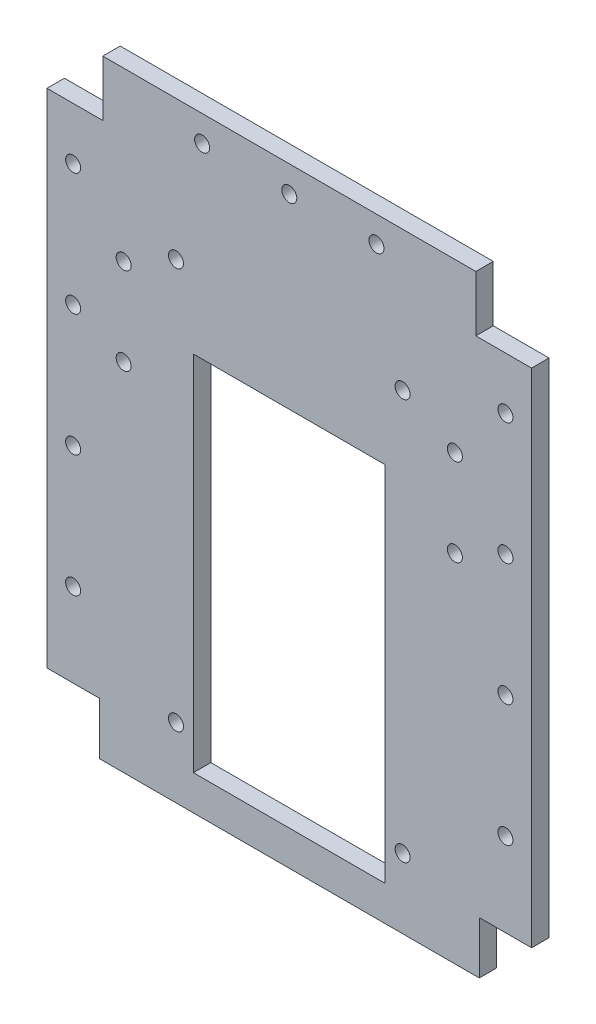
ISO-10303-21;
HEADER;
FILE_DESCRIPTION(('STEP AP214'),'2;1');
FILE_NAME('part.step','',(''),(''),'','','');
FILE_SCHEMA(('AUTOMOTIVE_DESIGN { 1 0 10303 214 1 1 1 1 }'));
ENDSEC;
DATA;
#1=APPLICATION_CONTEXT('core data for automotive mechanical design processes');
#2=APPLICATION_PROTOCOL_DEFINITION('international standard','automotive_design',2000,#1);
#3=PRODUCT_CONTEXT('',#1,'mechanical');
#4=PRODUCT('Part','Part','',(#3));
#5=PRODUCT_RELATED_PRODUCT_CATEGORY('part','',(#4));
#6=PRODUCT_DEFINITION_FORMATION('','',#4);
#7=PRODUCT_DEFINITION_CONTEXT('part definition',#1,'design');
#8=PRODUCT_DEFINITION('design','',#6,#7);
#9=PRODUCT_DEFINITION_SHAPE('','',#8);
#10=(LENGTH_UNIT() NAMED_UNIT(*) SI_UNIT(.MILLI.,.METRE.));
#11=(NAMED_UNIT(*) PLANE_ANGLE_UNIT() SI_UNIT($,.RADIAN.));
#12=(NAMED_UNIT(*) SI_UNIT($,.STERADIAN.) SOLID_ANGLE_UNIT());
#13=UNCERTAINTY_MEASURE_WITH_UNIT(LENGTH_MEASURE(1.E-05),#10,'distance_accuracy_value','');
#14=(GEOMETRIC_REPRESENTATION_CONTEXT(3) GLOBAL_UNCERTAINTY_ASSIGNED_CONTEXT((#13)) GLOBAL_UNIT_ASSIGNED_CONTEXT((#10,
#11,#12)) REPRESENTATION_CONTEXT('',''));
#15=CARTESIAN_POINT('',(0.,0.,0.));
#16=DIRECTION('',(0.,0.,1.));
#17=DIRECTION('',(1.,0.,0.));
#18=AXIS2_PLACEMENT_3D('',#15,#16,#17);
#19=CARTESIAN_POINT('',(0.,0.,5.));
#20=DIRECTION('',(0.,1.,0.));
#21=DIRECTION('',(0.,0.,1.));
#22=AXIS2_PLACEMENT_3D('',#19,#20,#21);
#23=PLANE('',#22);
#24=DIRECTION('',(0.,0.,-1.));
#25=VECTOR('',#24,1.);
#26=CARTESIAN_POINT('',(15.,0.,5.));
#27=LINE('',#26,#25);
#28=CARTESIAN_POINT('',(15.,0.,5.));
#29=VERTEX_POINT('',#28);
#30=CARTESIAN_POINT('',(15.,0.,0.));
#31=VERTEX_POINT('',#30);
#32=EDGE_CURVE('E242',#29,#31,#27,.T.);
#33=ORIENTED_EDGE('',*,*,#32,.F.);
#34=DIRECTION('',(1.,0.,0.));
#35=VECTOR('',#34,1.);
#36=CARTESIAN_POINT('',(0.,0.,5.));
#37=LINE('',#36,#35);
#38=CARTESIAN_POINT('',(0.,0.,5.));
#39=VERTEX_POINT('',#38);
#40=EDGE_CURVE('E393',#39,#29,#37,.T.);
#41=ORIENTED_EDGE('',*,*,#40,.F.);
#42=DIRECTION('',(0.,0.,-1.));
#43=VECTOR('',#42,1.);
#44=CARTESIAN_POINT('',(0.,0.,5.));
#45=LINE('',#44,#43);
#46=CARTESIAN_POINT('',(0.,0.,0.));
#47=VERTEX_POINT('',#46);
#48=EDGE_CURVE('E423',#39,#47,#45,.T.);
#49=ORIENTED_EDGE('',*,*,#48,.T.);
#50=DIRECTION('',(1.,0.,0.));
#51=VECTOR('',#50,1.);
#52=CARTESIAN_POINT('',(0.,0.,0.));
#53=LINE('',#52,#51);
#54=EDGE_CURVE('E409',#47,#31,#53,.T.);
#55=ORIENTED_EDGE('',*,*,#54,.T.);
#56=EDGE_LOOP('',(#33,#41,#49,#55));
#57=FACE_BOUND('',#56,.T.);
#58=ADVANCED_FACE('F47',(#57),#23,.F.);
#59=CARTESIAN_POINT('',(7.50000000000002,24.,0.));
#60=DIRECTION('',(0.,0.,1.));
#61=DIRECTION('',(1.,0.,0.));
#62=AXIS2_PLACEMENT_3D('',#59,#60,#61);
#63=CYLINDRICAL_SURFACE('',#62,2.15);
#64=CARTESIAN_POINT('',(7.50000000000002,24.,0.));
#65=DIRECTION('',(0.,0.,1.));
#66=DIRECTION('',(-1.,0.,0.));
#67=AXIS2_PLACEMENT_3D('',#64,#65,#66);
#68=CIRCLE('',#67,2.15);
#69=CARTESIAN_POINT('',(5.35000000000002,24.,0.));
#70=VERTEX_POINT('',#69);
#71=EDGE_CURVE('E56',#70,#70,#68,.T.);
#72=ORIENTED_EDGE('',*,*,#71,.F.);
#73=EDGE_LOOP('',(#72));
#74=FACE_BOUND('',#73,.T.);
#75=CARTESIAN_POINT('',(7.50000000000002,24.,5.));
#76=DIRECTION('',(0.,0.,1.));
#77=DIRECTION('',(-1.,0.,0.));
#78=AXIS2_PLACEMENT_3D('',#75,#76,#77);
#79=CIRCLE('',#78,2.15);
#80=CARTESIAN_POINT('',(5.35000000000002,24.,5.));
#81=VERTEX_POINT('',#80);
#82=EDGE_CURVE('E11',#81,#81,#79,.T.);
#83=ORIENTED_EDGE('',*,*,#82,.T.);
#84=EDGE_LOOP('',(#83));
#85=FACE_BOUND('',#84,.T.);
#86=ADVANCED_FACE('F49',(#74,#85),#63,.F.);
#87=CARTESIAN_POINT('',(7.50000000000002,59.,0.));
#88=DIRECTION('',(0.,0.,1.));
#89=DIRECTION('',(1.,0.,0.));
#90=AXIS2_PLACEMENT_3D('',#87,#88,#89);
#91=CYLINDRICAL_SURFACE('',#90,2.15);
#92=CARTESIAN_POINT('',(7.50000000000002,59.,0.));
#93=DIRECTION('',(0.,0.,1.));
#94=DIRECTION('',(-1.,0.,0.));
#95=AXIS2_PLACEMENT_3D('',#92,#93,#94);
#96=CIRCLE('',#95,2.15);
#97=CARTESIAN_POINT('',(5.35000000000002,59.,0.));
#98=VERTEX_POINT('',#97);
#99=EDGE_CURVE('E443',#98,#98,#96,.T.);
#100=ORIENTED_EDGE('',*,*,#99,.F.);
#101=EDGE_LOOP('',(#100));
#102=FACE_BOUND('',#101,.T.);
#103=CARTESIAN_POINT('',(7.50000000000002,59.,5.));
#104=DIRECTION('',(0.,0.,1.));
#105=DIRECTION('',(-1.,0.,0.));
#106=AXIS2_PLACEMENT_3D('',#103,#104,#105);
#107=CIRCLE('',#106,2.15);
#108=CARTESIAN_POINT('',(5.35000000000002,59.,5.));
#109=VERTEX_POINT('',#108);
#110=EDGE_CURVE('E447',#109,#109,#107,.T.);
#111=ORIENTED_EDGE('',*,*,#110,.T.);
#112=EDGE_LOOP('',(#111));
#113=FACE_BOUND('',#112,.T.);
#114=ADVANCED_FACE('F457',(#102,#113),#91,.F.);
#115=CARTESIAN_POINT('',(131.5,24.,0.));
#116=DIRECTION('',(0.,0.,1.));
#117=DIRECTION('',(1.,0.,0.));
#118=AXIS2_PLACEMENT_3D('',#115,#116,#117);
#119=CYLINDRICAL_SURFACE('',#118,2.15000000000002);
#120=CARTESIAN_POINT('',(131.5,24.,0.));
#121=DIRECTION('',(0.,0.,1.));
#122=DIRECTION('',(1.,0.,0.));
#123=AXIS2_PLACEMENT_3D('',#120,#121,#122);
#124=CIRCLE('',#123,2.15000000000002);
#125=CARTESIAN_POINT('',(133.65,24.,0.));
#126=VERTEX_POINT('',#125);
#127=EDGE_CURVE('E435',#126,#126,#124,.T.);
#128=ORIENTED_EDGE('',*,*,#127,.F.);
#129=EDGE_LOOP('',(#128));
#130=FACE_BOUND('',#129,.T.);
#131=CARTESIAN_POINT('',(131.5,24.,5.));
#132=DIRECTION('',(0.,0.,1.));
#133=DIRECTION('',(1.,0.,0.));
#134=AXIS2_PLACEMENT_3D('',#131,#132,#133);
#135=CIRCLE('',#134,2.15000000000002);
#136=CARTESIAN_POINT('',(133.65,24.,5.));
#137=VERTEX_POINT('',#136);
#138=EDGE_CURVE('E439',#137,#137,#135,.T.);
#139=ORIENTED_EDGE('',*,*,#138,.T.);
#140=EDGE_LOOP('',(#139));
#141=FACE_BOUND('',#140,.T.);
#142=ADVANCED_FACE('F529',(#130,#141),#119,.F.);
#143=CARTESIAN_POINT('',(131.5,59.,0.));
#144=DIRECTION('',(0.,0.,1.));
#145=DIRECTION('',(1.,0.,0.));
#146=AXIS2_PLACEMENT_3D('',#143,#144,#145);
#147=CYLINDRICAL_SURFACE('',#146,2.15000000000002);
#148=CARTESIAN_POINT('',(131.5,59.,0.));
#149=DIRECTION('',(0.,0.,1.));
#150=DIRECTION('',(1.,0.,0.));
#151=AXIS2_PLACEMENT_3D('',#148,#149,#150);
#152=CIRCLE('',#151,2.15000000000002);
#153=CARTESIAN_POINT('',(133.65,59.,0.));
#154=VERTEX_POINT('',#153);
#155=EDGE_CURVE('E427',#154,#154,#152,.T.);
#156=ORIENTED_EDGE('',*,*,#155,.F.);
#157=EDGE_LOOP('',(#156));
#158=FACE_BOUND('',#157,.T.);
#159=CARTESIAN_POINT('',(131.5,59.,5.));
#160=DIRECTION('',(0.,0.,1.));
#161=DIRECTION('',(1.,0.,0.));
#162=AXIS2_PLACEMENT_3D('',#159,#160,#161);
#163=CIRCLE('',#162,2.15000000000002);
#164=CARTESIAN_POINT('',(133.65,59.,5.));
#165=VERTEX_POINT('',#164);
#166=EDGE_CURVE('E431',#165,#165,#163,.T.);
#167=ORIENTED_EDGE('',*,*,#166,.T.);
#168=EDGE_LOOP('',(#167));
#169=FACE_BOUND('',#168,.T.);
#170=ADVANCED_FACE('F498',(#158,#169),#147,.F.);
#171=CARTESIAN_POINT('',(0.,0.,5.));
#172=DIRECTION('',(1.,0.,0.));
#173=DIRECTION('',(0.,0.,-1.));
#174=AXIS2_PLACEMENT_3D('',#171,#172,#173);
#175=PLANE('',#174);
#176=DIRECTION('',(0.,-1.,0.));
#177=VECTOR('',#176,1.);
#178=CARTESIAN_POINT('',(0.,0.,5.));
#179=LINE('',#178,#177);
#180=CARTESIAN_POINT('',(0.,144.,5.));
#181=VERTEX_POINT('',#180);
#182=EDGE_CURVE('E388',#181,#39,#179,.T.);
#183=ORIENTED_EDGE('',*,*,#182,.F.);
#184=DIRECTION('',(0.,0.,1.));
#185=VECTOR('',#184,1.);
#186=CARTESIAN_POINT('',(0.,144.,0.));
#187=LINE('',#186,#185);
#188=CARTESIAN_POINT('',(0.,144.,0.));
#189=VERTEX_POINT('',#188);
#190=EDGE_CURVE('E365',#189,#181,#187,.T.);
#191=ORIENTED_EDGE('',*,*,#190,.F.);
#192=DIRECTION('',(0.,-1.,0.));
#193=VECTOR('',#192,1.);
#194=CARTESIAN_POINT('',(0.,0.,0.));
#195=LINE('',#194,#193);
#196=EDGE_CURVE('E359',#189,#47,#195,.T.);
#197=ORIENTED_EDGE('',*,*,#196,.T.);
#198=ORIENTED_EDGE('',*,*,#48,.F.);
#199=EDGE_LOOP('',(#183,#191,#197,#198));
#200=FACE_BOUND('',#199,.T.);
#201=ADVANCED_FACE('F490',(#200),#175,.F.);
#202=CARTESIAN_POINT('',(124.,0.,5.));
#203=VERTEX_POINT('',#202);
#204=CARTESIAN_POINT('',(139.,0.,5.));
#205=VERTEX_POINT('',#204);
#206=EDGE_CURVE('E391',#203,#205,#37,.T.);
#207=ORIENTED_EDGE('',*,*,#206,.F.);
#208=DIRECTION('',(0.,0.,-1.));
#209=VECTOR('',#208,1.);
#210=CARTESIAN_POINT('',(124.,0.,5.));
#211=LINE('',#210,#209);
#212=CARTESIAN_POINT('',(124.,0.,0.));
#213=VERTEX_POINT('',#212);
#214=EDGE_CURVE('E237',#203,#213,#211,.T.);
#215=ORIENTED_EDGE('',*,*,#214,.T.);
#216=CARTESIAN_POINT('',(139.,0.,0.));
#217=VERTEX_POINT('',#216);
#218=EDGE_CURVE('E408',#213,#217,#53,.T.);
#219=ORIENTED_EDGE('',*,*,#218,.T.);
#220=DIRECTION('',(0.,0.,-1.));
#221=VECTOR('',#220,1.);
#222=CARTESIAN_POINT('',(139.,0.,5.));
#223=LINE('',#222,#221);
#224=EDGE_CURVE('E405',#205,#217,#223,.T.);
#225=ORIENTED_EDGE('',*,*,#224,.F.);
#226=EDGE_LOOP('',(#207,#215,#219,#225));
#227=FACE_BOUND('',#226,.T.);
#228=ADVANCED_FACE('F482',(#227),#23,.F.);
#229=CARTESIAN_POINT('',(139.,0.,5.));
#230=DIRECTION('',(-1.,0.,0.));
#231=DIRECTION('',(0.,0.,1.));
#232=AXIS2_PLACEMENT_3D('',#229,#230,#231);
#233=PLANE('',#232);
#234=DIRECTION('',(0.,1.,0.));
#235=VECTOR('',#234,1.);
#236=CARTESIAN_POINT('',(139.,0.,0.));
#237=LINE('',#236,#235);
#238=CARTESIAN_POINT('',(139.,144.,0.));
#239=VERTEX_POINT('',#238);
#240=EDGE_CURVE('E413',#217,#239,#237,.T.);
#241=ORIENTED_EDGE('',*,*,#240,.T.);
#242=DIRECTION('',(0.,0.,1.));
#243=VECTOR('',#242,1.);
#244=CARTESIAN_POINT('',(139.,144.,0.));
#245=LINE('',#244,#243);
#246=CARTESIAN_POINT('',(139.,144.,5.));
#247=VERTEX_POINT('',#246);
#248=EDGE_CURVE('E355',#239,#247,#245,.T.);
#249=ORIENTED_EDGE('',*,*,#248,.T.);
#250=DIRECTION('',(0.,1.,0.));
#251=VECTOR('',#250,1.);
#252=CARTESIAN_POINT('',(139.,0.,5.));
#253=LINE('',#252,#251);
#254=EDGE_CURVE('E397',#205,#247,#253,.T.);
#255=ORIENTED_EDGE('',*,*,#254,.F.);
#256=ORIENTED_EDGE('',*,*,#224,.T.);
#257=EDGE_LOOP('',(#241,#249,#255,#256));
#258=FACE_BOUND('',#257,.T.);
#259=ADVANCED_FACE('F473',(#258),#233,.F.);
#260=CARTESIAN_POINT('',(0.,160.,5.));
#261=DIRECTION('',(0.,-1.,0.));
#262=DIRECTION('',(0.,0.,-1.));
#263=AXIS2_PLACEMENT_3D('',#260,#261,#262);
#264=PLANE('',#263);
#265=DIRECTION('',(-1.,0.,0.));
#266=VECTOR('',#265,1.);
#267=CARTESIAN_POINT('',(0.,160.,5.));
#268=LINE('',#267,#266);
#269=CARTESIAN_POINT('',(123.,160.,5.));
#270=VERTEX_POINT('',#269);
#271=CARTESIAN_POINT('',(16.,160.,5.));
#272=VERTEX_POINT('',#271);
#273=EDGE_CURVE('E401',#270,#272,#268,.T.);
#274=ORIENTED_EDGE('',*,*,#273,.F.);
#275=DIRECTION('',(0.,0.,1.));
#276=VECTOR('',#275,1.);
#277=CARTESIAN_POINT('',(123.,160.,0.));
#278=LINE('',#277,#276);
#279=CARTESIAN_POINT('',(123.,160.,0.));
#280=VERTEX_POINT('',#279);
#281=EDGE_CURVE('E347',#280,#270,#278,.T.);
#282=ORIENTED_EDGE('',*,*,#281,.F.);
#283=DIRECTION('',(-1.,0.,0.));
#284=VECTOR('',#283,1.);
#285=CARTESIAN_POINT('',(0.,160.,0.));
#286=LINE('',#285,#284);
#287=CARTESIAN_POINT('',(16.,160.,0.));
#288=VERTEX_POINT('',#287);
#289=EDGE_CURVE('E392',#280,#288,#286,.T.);
#290=ORIENTED_EDGE('',*,*,#289,.T.);
#291=DIRECTION('',(0.,0.,1.));
#292=VECTOR('',#291,1.);
#293=CARTESIAN_POINT('',(16.,160.,0.));
#294=LINE('',#293,#292);
#295=EDGE_CURVE('E334',#288,#272,#294,.T.);
#296=ORIENTED_EDGE('',*,*,#295,.T.);
#297=EDGE_LOOP('',(#274,#282,#290,#296));
#298=FACE_BOUND('',#297,.T.);
#299=ADVANCED_FACE('F462',(#298),#264,.F.);
#300=CARTESIAN_POINT('',(0.,0.,5.));
#301=DIRECTION('',(0.,0.,-1.));
#302=DIRECTION('',(-1.,0.,0.));
#303=AXIS2_PLACEMENT_3D('',#300,#301,#302);
#304=PLANE('',#303);
#305=CARTESIAN_POINT('',(37.,5.,5.));
#306=DIRECTION('',(0.,0.,1.));
#307=DIRECTION('',(-1.,0.,0.));
#308=AXIS2_PLACEMENT_3D('',#305,#306,#307);
#309=CIRCLE('',#308,2.15);
#310=CARTESIAN_POINT('',(34.85,5.,5.));
#311=VERTEX_POINT('',#310);
#312=EDGE_CURVE('E900',#311,#311,#309,.T.);
#313=ORIENTED_EDGE('',*,*,#312,.F.);
#314=EDGE_LOOP('',(#313));
#315=FACE_BOUND('',#314,.T.);
#316=CARTESIAN_POINT('',(37.,120.,5.));
#317=DIRECTION('',(0.,0.,1.));
#318=DIRECTION('',(-1.,0.,0.));
#319=AXIS2_PLACEMENT_3D('',#316,#317,#318);
#320=CIRCLE('',#319,2.15);
#321=CARTESIAN_POINT('',(34.85,120.,5.));
#322=VERTEX_POINT('',#321);
#323=EDGE_CURVE('E907',#322,#322,#320,.T.);
#324=ORIENTED_EDGE('',*,*,#323,.F.);
#325=EDGE_LOOP('',(#324));
#326=FACE_BOUND('',#325,.T.);
#327=CARTESIAN_POINT('',(102.,120.,5.));
#328=DIRECTION('',(0.,0.,1.));
#329=DIRECTION('',(1.,0.,0.));
#330=AXIS2_PLACEMENT_3D('',#327,#328,#329);
#331=CIRCLE('',#330,2.15);
#332=CARTESIAN_POINT('',(104.15,120.,5.));
#333=VERTEX_POINT('',#332);
#334=EDGE_CURVE('E917',#333,#333,#331,.T.);
#335=ORIENTED_EDGE('',*,*,#334,.F.);
#336=EDGE_LOOP('',(#335));
#337=FACE_BOUND('',#336,.T.);
#338=CARTESIAN_POINT('',(102.,5.,5.));
#339=DIRECTION('',(0.,0.,1.));
#340=DIRECTION('',(1.,0.,0.));
#341=AXIS2_PLACEMENT_3D('',#338,#339,#340);
#342=CIRCLE('',#341,2.15);
#343=CARTESIAN_POINT('',(104.15,5.,5.));
#344=VERTEX_POINT('',#343);
#345=EDGE_CURVE('E189',#344,#344,#342,.T.);
#346=ORIENTED_EDGE('',*,*,#345,.F.);
#347=EDGE_LOOP('',(#346));
#348=FACE_BOUND('',#347,.T.);
#349=DIRECTION('',(1.,0.,0.));
#350=VECTOR('',#349,1.);
#351=CARTESIAN_POINT('',(42.,-4.99999999999999,5.));
#352=LINE('',#351,#350);
#353=CARTESIAN_POINT('',(42.,-4.99999999999999,5.));
#354=VERTEX_POINT('',#353);
#355=CARTESIAN_POINT('',(97.,-4.99999999999999,5.));
#356=VERTEX_POINT('',#355);
#357=EDGE_CURVE('E198',#354,#356,#352,.T.);
#358=ORIENTED_EDGE('',*,*,#357,.F.);
#359=DIRECTION('',(0.,-1.,0.));
#360=VECTOR('',#359,1.);
#361=CARTESIAN_POINT('',(42.,-4.99999999999999,5.));
#362=LINE('',#361,#360);
#363=CARTESIAN_POINT('',(42.,99.,5.));
#364=VERTEX_POINT('',#363);
#365=EDGE_CURVE('E63',#364,#354,#362,.T.);
#366=ORIENTED_EDGE('',*,*,#365,.F.);
#367=DIRECTION('',(-1.,0.,0.));
#368=VECTOR('',#367,1.);
#369=CARTESIAN_POINT('',(42.,99.,5.));
#370=LINE('',#369,#368);
#371=CARTESIAN_POINT('',(97.,99.,5.));
#372=VERTEX_POINT('',#371);
#373=EDGE_CURVE('E182',#372,#364,#370,.T.);
#374=ORIENTED_EDGE('',*,*,#373,.F.);
#375=DIRECTION('',(0.,1.,0.));
#376=VECTOR('',#375,1.);
#377=CARTESIAN_POINT('',(97.,-4.99999999999999,5.));
#378=LINE('',#377,#376);
#379=EDGE_CURVE('E186',#356,#372,#378,.T.);
#380=ORIENTED_EDGE('',*,*,#379,.F.);
#381=EDGE_LOOP('',(#358,#366,#374,#380));
#382=FACE_BOUND('',#381,.T.);
#383=CARTESIAN_POINT('',(22.,112.,5.));
#384=DIRECTION('',(0.,0.,1.));
#385=DIRECTION('',(-1.,0.,0.));
#386=AXIS2_PLACEMENT_3D('',#383,#384,#385);
#387=CIRCLE('',#386,2.15);
#388=CARTESIAN_POINT('',(19.85,112.,5.));
#389=VERTEX_POINT('',#388);
#390=EDGE_CURVE('E267',#389,#389,#387,.T.);
#391=ORIENTED_EDGE('',*,*,#390,.F.);
#392=EDGE_LOOP('',(#391));
#393=FACE_BOUND('',#392,.T.);
#394=CARTESIAN_POINT('',(22.,87.,5.));
#395=DIRECTION('',(0.,0.,1.));
#396=DIRECTION('',(-1.,0.,0.));
#397=AXIS2_PLACEMENT_3D('',#394,#395,#396);
#398=CIRCLE('',#397,2.15);
#399=CARTESIAN_POINT('',(19.85,87.,5.));
#400=VERTEX_POINT('',#399);
#401=EDGE_CURVE('E259',#400,#400,#398,.T.);
#402=ORIENTED_EDGE('',*,*,#401,.F.);
#403=EDGE_LOOP('',(#402));
#404=FACE_BOUND('',#403,.T.);
#405=CARTESIAN_POINT('',(117.,87.,5.));
#406=DIRECTION('',(0.,0.,1.));
#407=DIRECTION('',(1.,0.,0.));
#408=AXIS2_PLACEMENT_3D('',#405,#406,#407);
#409=CIRCLE('',#408,2.15);
#410=CARTESIAN_POINT('',(119.15,87.,5.));
#411=VERTEX_POINT('',#410);
#412=EDGE_CURVE('E250',#411,#411,#409,.T.);
#413=ORIENTED_EDGE('',*,*,#412,.F.);
#414=EDGE_LOOP('',(#413));
#415=FACE_BOUND('',#414,.T.);
#416=CARTESIAN_POINT('',(117.,112.,5.));
#417=DIRECTION('',(0.,0.,1.));
#418=DIRECTION('',(1.,0.,0.));
#419=AXIS2_PLACEMENT_3D('',#416,#417,#418);
#420=CIRCLE('',#419,2.15);
#421=CARTESIAN_POINT('',(119.15,112.,5.));
#422=VERTEX_POINT('',#421);
#423=EDGE_CURVE('E254',#422,#422,#420,.T.);
#424=ORIENTED_EDGE('',*,*,#423,.F.);
#425=EDGE_LOOP('',(#424));
#426=FACE_BOUND('',#425,.T.);
#427=CARTESIAN_POINT('',(7.50000000000002,94.,5.));
#428=DIRECTION('',(0.,0.,1.));
#429=DIRECTION('',(-1.,0.,0.));
#430=AXIS2_PLACEMENT_3D('',#427,#428,#429);
#431=CIRCLE('',#430,2.15);
#432=CARTESIAN_POINT('',(5.35000000000002,94.,5.));
#433=VERTEX_POINT('',#432);
#434=EDGE_CURVE('E285',#433,#433,#431,.T.);
#435=ORIENTED_EDGE('',*,*,#434,.F.);
#436=EDGE_LOOP('',(#435));
#437=FACE_BOUND('',#436,.T.);
#438=CARTESIAN_POINT('',(131.5,94.,5.));
#439=DIRECTION('',(0.,0.,1.));
#440=DIRECTION('',(1.,0.,0.));
#441=AXIS2_PLACEMENT_3D('',#438,#439,#440);
#442=CIRCLE('',#441,2.15000000000002);
#443=CARTESIAN_POINT('',(133.65,94.,5.));
#444=VERTEX_POINT('',#443);
#445=EDGE_CURVE('E293',#444,#444,#442,.T.);
#446=ORIENTED_EDGE('',*,*,#445,.F.);
#447=EDGE_LOOP('',(#446));
#448=FACE_BOUND('',#447,.T.);
#449=CARTESIAN_POINT('',(131.5,129.,5.));
#450=DIRECTION('',(0.,0.,1.));
#451=DIRECTION('',(1.,0.,0.));
#452=AXIS2_PLACEMENT_3D('',#449,#450,#451);
#453=CIRCLE('',#452,2.15000000000002);
#454=CARTESIAN_POINT('',(133.65,129.,5.));
#455=VERTEX_POINT('',#454);
#456=EDGE_CURVE('E303',#455,#455,#453,.T.);
#457=ORIENTED_EDGE('',*,*,#456,.F.);
#458=EDGE_LOOP('',(#457));
#459=FACE_BOUND('',#458,.T.);
#460=CARTESIAN_POINT('',(7.50000000000002,129.,5.));
#461=DIRECTION('',(0.,0.,1.));
#462=DIRECTION('',(-1.,0.,0.));
#463=AXIS2_PLACEMENT_3D('',#460,#461,#462);
#464=CIRCLE('',#463,2.15);
#465=CARTESIAN_POINT('',(5.35000000000002,129.,5.));
#466=VERTEX_POINT('',#465);
#467=EDGE_CURVE('E307',#466,#466,#464,.T.);
#468=ORIENTED_EDGE('',*,*,#467,.F.);
#469=EDGE_LOOP('',(#468));
#470=FACE_BOUND('',#469,.T.);
#471=CARTESIAN_POINT('',(94.5,152.5,5.));
#472=DIRECTION('',(0.,0.,1.));
#473=DIRECTION('',(-1.,0.,0.));
#474=AXIS2_PLACEMENT_3D('',#471,#472,#473);
#475=CIRCLE('',#474,2.14999999999999);
#476=CARTESIAN_POINT('',(92.35,152.5,5.));
#477=VERTEX_POINT('',#476);
#478=EDGE_CURVE('E323',#477,#477,#475,.T.);
#479=ORIENTED_EDGE('',*,*,#478,.F.);
#480=EDGE_LOOP('',(#479));
#481=FACE_BOUND('',#480,.T.);
#482=CARTESIAN_POINT('',(44.5,152.5,5.));
#483=DIRECTION('',(0.,0.,1.));
#484=DIRECTION('',(1.,0.,0.));
#485=AXIS2_PLACEMENT_3D('',#482,#483,#484);
#486=CIRCLE('',#485,2.15);
#487=CARTESIAN_POINT('',(46.65,152.5,5.));
#488=VERTEX_POINT('',#487);
#489=EDGE_CURVE('E314',#488,#488,#486,.T.);
#490=ORIENTED_EDGE('',*,*,#489,.F.);
#491=EDGE_LOOP('',(#490));
#492=FACE_BOUND('',#491,.T.);
#493=CARTESIAN_POINT('',(69.5,152.5,5.));
#494=DIRECTION('',(0.,0.,1.));
#495=DIRECTION('',(1.,0.,0.));
#496=AXIS2_PLACEMENT_3D('',#493,#494,#495);
#497=CIRCLE('',#496,2.15);
#498=CARTESIAN_POINT('',(71.65,152.5,5.));
#499=VERTEX_POINT('',#498);
#500=EDGE_CURVE('E318',#499,#499,#497,.T.);
#501=ORIENTED_EDGE('',*,*,#500,.F.);
#502=EDGE_LOOP('',(#501));
#503=FACE_BOUND('',#502,.T.);
#504=ORIENTED_EDGE('',*,*,#254,.T.);
#505=DIRECTION('',(1.,0.,0.));
#506=VECTOR('',#505,1.);
#507=CARTESIAN_POINT('',(139.,144.,5.));
#508=LINE('',#507,#506);
#509=CARTESIAN_POINT('',(123.,144.,5.));
#510=VERTEX_POINT('',#509);
#511=EDGE_CURVE('E343',#510,#247,#508,.T.);
#512=ORIENTED_EDGE('',*,*,#511,.F.);
#513=DIRECTION('',(0.,-1.,0.));
#514=VECTOR('',#513,1.);
#515=CARTESIAN_POINT('',(123.,160.,5.));
#516=LINE('',#515,#514);
#517=EDGE_CURVE('E348',#270,#510,#516,.T.);
#518=ORIENTED_EDGE('',*,*,#517,.F.);
#519=ORIENTED_EDGE('',*,*,#273,.T.);
#520=DIRECTION('',(0.,1.,0.));
#521=VECTOR('',#520,1.);
#522=CARTESIAN_POINT('',(16.,160.,5.));
#523=LINE('',#522,#521);
#524=CARTESIAN_POINT('',(16.,144.,5.));
#525=VERTEX_POINT('',#524);
#526=EDGE_CURVE('E375',#525,#272,#523,.T.);
#527=ORIENTED_EDGE('',*,*,#526,.F.);
#528=DIRECTION('',(1.,0.,0.));
#529=VECTOR('',#528,1.);
#530=CARTESIAN_POINT('',(0.,144.,5.));
#531=LINE('',#530,#529);
#532=EDGE_CURVE('E352',#181,#525,#531,.T.);
#533=ORIENTED_EDGE('',*,*,#532,.F.);
#534=ORIENTED_EDGE('',*,*,#182,.T.);
#535=ORIENTED_EDGE('',*,*,#40,.T.);
#536=DIRECTION('',(0.,1.,0.));
#537=VECTOR('',#536,1.);
#538=CARTESIAN_POINT('',(15.,0.,5.));
#539=LINE('',#538,#537);
#540=CARTESIAN_POINT('',(15.,-15.,5.));
#541=VERTEX_POINT('',#540);
#542=EDGE_CURVE('E223',#541,#29,#539,.T.);
#543=ORIENTED_EDGE('',*,*,#542,.F.);
#544=DIRECTION('',(-1.,0.,0.));
#545=VECTOR('',#544,1.);
#546=CARTESIAN_POINT('',(124.,-15.,5.));
#547=LINE('',#546,#545);
#548=CARTESIAN_POINT('',(124.,-15.,5.));
#549=VERTEX_POINT('',#548);
#550=EDGE_CURVE('E218',#549,#541,#547,.T.);
#551=ORIENTED_EDGE('',*,*,#550,.F.);
#552=DIRECTION('',(0.,-1.,0.));
#553=VECTOR('',#552,1.);
#554=CARTESIAN_POINT('',(124.,0.,5.));
#555=LINE('',#554,#553);
#556=EDGE_CURVE('E214',#203,#549,#555,.T.);
#557=ORIENTED_EDGE('',*,*,#556,.F.);
#558=ORIENTED_EDGE('',*,*,#206,.T.);
#559=EDGE_LOOP('',(#504,#512,#518,#519,#527,#533,#534,#535,#543,#551,#557,#558));
#560=FACE_BOUND('',#559,.T.);
#561=ORIENTED_EDGE('',*,*,#166,.F.);
#562=EDGE_LOOP('',(#561));
#563=FACE_BOUND('',#562,.T.);
#564=ORIENTED_EDGE('',*,*,#138,.F.);
#565=EDGE_LOOP('',(#564));
#566=FACE_BOUND('',#565,.T.);
#567=ORIENTED_EDGE('',*,*,#110,.F.);
#568=EDGE_LOOP('',(#567));
#569=FACE_BOUND('',#568,.T.);
#570=ORIENTED_EDGE('',*,*,#82,.F.);
#571=EDGE_LOOP('',(#570));
#572=FACE_BOUND('',#571,.T.);
#573=ADVANCED_FACE('F460',(#315,#326,#337,#348,#382,#393,#404,#415,#426,#437,#448,#459,#470,
#481,#492,#503,#560,#563,#566,#569,#572),#304,.F.);
#574=CARTESIAN_POINT('',(0.,0.,0.));
#575=DIRECTION('',(0.,0.,-1.));
#576=DIRECTION('',(-1.,0.,0.));
#577=AXIS2_PLACEMENT_3D('',#574,#575,#576);
#578=PLANE('',#577);
#579=CARTESIAN_POINT('',(37.,5.,0.));
#580=DIRECTION('',(0.,0.,1.));
#581=DIRECTION('',(-1.,0.,0.));
#582=AXIS2_PLACEMENT_3D('',#579,#580,#581);
#583=CIRCLE('',#582,2.15);
#584=CARTESIAN_POINT('',(34.85,5.,0.));
#585=VERTEX_POINT('',#584);
#586=EDGE_CURVE('E898',#585,#585,#583,.T.);
#587=ORIENTED_EDGE('',*,*,#586,.T.);
#588=EDGE_LOOP('',(#587));
#589=FACE_BOUND('',#588,.T.);
#590=CARTESIAN_POINT('',(37.,120.,0.));
#591=DIRECTION('',(0.,0.,1.));
#592=DIRECTION('',(-1.,0.,0.));
#593=AXIS2_PLACEMENT_3D('',#590,#591,#592);
#594=CIRCLE('',#593,2.15);
#595=CARTESIAN_POINT('',(34.85,120.,0.));
#596=VERTEX_POINT('',#595);
#597=EDGE_CURVE('E902',#596,#596,#594,.T.);
#598=ORIENTED_EDGE('',*,*,#597,.T.);
#599=EDGE_LOOP('',(#598));
#600=FACE_BOUND('',#599,.T.);
#601=CARTESIAN_POINT('',(102.,120.,0.));
#602=DIRECTION('',(0.,0.,1.));
#603=DIRECTION('',(1.,0.,0.));
#604=AXIS2_PLACEMENT_3D('',#601,#602,#603);
#605=CIRCLE('',#604,2.15);
#606=CARTESIAN_POINT('',(104.15,120.,0.));
#607=VERTEX_POINT('',#606);
#608=EDGE_CURVE('E922',#607,#607,#605,.T.);
#609=ORIENTED_EDGE('',*,*,#608,.T.);
#610=EDGE_LOOP('',(#609));
#611=FACE_BOUND('',#610,.T.);
#612=CARTESIAN_POINT('',(102.,5.,0.));
#613=DIRECTION('',(0.,0.,1.));
#614=DIRECTION('',(1.,0.,0.));
#615=AXIS2_PLACEMENT_3D('',#612,#613,#614);
#616=CIRCLE('',#615,2.15);
#617=CARTESIAN_POINT('',(104.15,5.,0.));
#618=VERTEX_POINT('',#617);
#619=EDGE_CURVE('E199',#618,#618,#616,.T.);
#620=ORIENTED_EDGE('',*,*,#619,.T.);
#621=EDGE_LOOP('',(#620));
#622=FACE_BOUND('',#621,.T.);
#623=DIRECTION('',(0.,-1.,0.));
#624=VECTOR('',#623,1.);
#625=CARTESIAN_POINT('',(42.,-4.99999999999999,0.));
#626=LINE('',#625,#624);
#627=CARTESIAN_POINT('',(42.,99.,0.));
#628=VERTEX_POINT('',#627);
#629=CARTESIAN_POINT('',(42.,-4.99999999999999,0.));
#630=VERTEX_POINT('',#629);
#631=EDGE_CURVE('E163',#628,#630,#626,.T.);
#632=ORIENTED_EDGE('',*,*,#631,.T.);
#633=DIRECTION('',(1.,0.,0.));
#634=VECTOR('',#633,1.);
#635=CARTESIAN_POINT('',(42.,-4.99999999999999,0.));
#636=LINE('',#635,#634);
#637=CARTESIAN_POINT('',(97.,-4.99999999999999,0.));
#638=VERTEX_POINT('',#637);
#639=EDGE_CURVE('E173',#630,#638,#636,.T.);
#640=ORIENTED_EDGE('',*,*,#639,.T.);
#641=DIRECTION('',(0.,1.,0.));
#642=VECTOR('',#641,1.);
#643=CARTESIAN_POINT('',(97.,-4.99999999999999,0.));
#644=LINE('',#643,#642);
#645=CARTESIAN_POINT('',(97.,99.,0.));
#646=VERTEX_POINT('',#645);
#647=EDGE_CURVE('E71',#638,#646,#644,.T.);
#648=ORIENTED_EDGE('',*,*,#647,.T.);
#649=DIRECTION('',(-1.,0.,0.));
#650=VECTOR('',#649,1.);
#651=CARTESIAN_POINT('',(42.,99.,0.));
#652=LINE('',#651,#650);
#653=EDGE_CURVE('E170',#646,#628,#652,.T.);
#654=ORIENTED_EDGE('',*,*,#653,.T.);
#655=EDGE_LOOP('',(#632,#640,#648,#654));
#656=FACE_BOUND('',#655,.T.);
#657=CARTESIAN_POINT('',(22.,112.,0.));
#658=DIRECTION('',(0.,0.,1.));
#659=DIRECTION('',(-1.,0.,0.));
#660=AXIS2_PLACEMENT_3D('',#657,#658,#659);
#661=CIRCLE('',#660,2.15);
#662=CARTESIAN_POINT('',(19.85,112.,0.));
#663=VERTEX_POINT('',#662);
#664=EDGE_CURVE('E241',#663,#663,#661,.T.);
#665=ORIENTED_EDGE('',*,*,#664,.T.);
#666=EDGE_LOOP('',(#665));
#667=FACE_BOUND('',#666,.T.);
#668=CARTESIAN_POINT('',(22.,87.,0.));
#669=DIRECTION('',(0.,0.,1.));
#670=DIRECTION('',(-1.,0.,0.));
#671=AXIS2_PLACEMENT_3D('',#668,#669,#670);
#672=CIRCLE('',#671,2.15);
#673=CARTESIAN_POINT('',(19.85,87.,0.));
#674=VERTEX_POINT('',#673);
#675=EDGE_CURVE('E263',#674,#674,#672,.T.);
#676=ORIENTED_EDGE('',*,*,#675,.T.);
#677=EDGE_LOOP('',(#676));
#678=FACE_BOUND('',#677,.T.);
#679=CARTESIAN_POINT('',(117.,87.,0.));
#680=DIRECTION('',(0.,0.,1.));
#681=DIRECTION('',(1.,0.,0.));
#682=AXIS2_PLACEMENT_3D('',#679,#680,#681);
#683=CIRCLE('',#682,2.15);
#684=CARTESIAN_POINT('',(119.15,87.,0.));
#685=VERTEX_POINT('',#684);
#686=EDGE_CURVE('E255',#685,#685,#683,.T.);
#687=ORIENTED_EDGE('',*,*,#686,.T.);
#688=EDGE_LOOP('',(#687));
#689=FACE_BOUND('',#688,.T.);
#690=CARTESIAN_POINT('',(117.,112.,0.));
#691=DIRECTION('',(0.,0.,1.));
#692=DIRECTION('',(1.,0.,0.));
#693=AXIS2_PLACEMENT_3D('',#690,#691,#692);
#694=CIRCLE('',#693,2.15);
#695=CARTESIAN_POINT('',(119.15,112.,0.));
#696=VERTEX_POINT('',#695);
#697=EDGE_CURVE('E274',#696,#696,#694,.T.);
#698=ORIENTED_EDGE('',*,*,#697,.T.);
#699=EDGE_LOOP('',(#698));
#700=FACE_BOUND('',#699,.T.);
#701=CARTESIAN_POINT('',(7.50000000000002,94.,0.));
#702=DIRECTION('',(0.,0.,1.));
#703=DIRECTION('',(-1.,0.,0.));
#704=AXIS2_PLACEMENT_3D('',#701,#702,#703);
#705=CIRCLE('',#704,2.15);
#706=CARTESIAN_POINT('',(5.35000000000002,94.,0.));
#707=VERTEX_POINT('',#706);
#708=EDGE_CURVE('E278',#707,#707,#705,.T.);
#709=ORIENTED_EDGE('',*,*,#708,.T.);
#710=EDGE_LOOP('',(#709));
#711=FACE_BOUND('',#710,.T.);
#712=CARTESIAN_POINT('',(131.5,94.,0.));
#713=DIRECTION('',(0.,0.,1.));
#714=DIRECTION('',(1.,0.,0.));
#715=AXIS2_PLACEMENT_3D('',#712,#713,#714);
#716=CIRCLE('',#715,2.15000000000002);
#717=CARTESIAN_POINT('',(133.65,94.,0.));
#718=VERTEX_POINT('',#717);
#719=EDGE_CURVE('E289',#718,#718,#716,.T.);
#720=ORIENTED_EDGE('',*,*,#719,.T.);
#721=EDGE_LOOP('',(#720));
#722=FACE_BOUND('',#721,.T.);
#723=CARTESIAN_POINT('',(131.5,129.,0.));
#724=DIRECTION('',(0.,0.,1.));
#725=DIRECTION('',(1.,0.,0.));
#726=AXIS2_PLACEMENT_3D('',#723,#724,#725);
#727=CIRCLE('',#726,2.15000000000002);
#728=CARTESIAN_POINT('',(133.65,129.,0.));
#729=VERTEX_POINT('',#728);
#730=EDGE_CURVE('E298',#729,#729,#727,.T.);
#731=ORIENTED_EDGE('',*,*,#730,.T.);
#732=EDGE_LOOP('',(#731));
#733=FACE_BOUND('',#732,.T.);
#734=CARTESIAN_POINT('',(7.50000000000002,129.,0.));
#735=DIRECTION('',(0.,0.,1.));
#736=DIRECTION('',(-1.,0.,0.));
#737=AXIS2_PLACEMENT_3D('',#734,#735,#736);
#738=CIRCLE('',#737,2.15);
#739=CARTESIAN_POINT('',(5.35000000000002,129.,0.));
#740=VERTEX_POINT('',#739);
#741=EDGE_CURVE('E297',#740,#740,#738,.T.);
#742=ORIENTED_EDGE('',*,*,#741,.T.);
#743=EDGE_LOOP('',(#742));
#744=FACE_BOUND('',#743,.T.);
#745=CARTESIAN_POINT('',(94.5,152.5,0.));
#746=DIRECTION('',(0.,0.,1.));
#747=DIRECTION('',(-1.,0.,0.));
#748=AXIS2_PLACEMENT_3D('',#745,#746,#747);
#749=CIRCLE('',#748,2.14999999999999);
#750=CARTESIAN_POINT('',(92.35,152.5,0.));
#751=VERTEX_POINT('',#750);
#752=EDGE_CURVE('E302',#751,#751,#749,.T.);
#753=ORIENTED_EDGE('',*,*,#752,.T.);
#754=EDGE_LOOP('',(#753));
#755=FACE_BOUND('',#754,.T.);
#756=CARTESIAN_POINT('',(44.5,152.5,0.));
#757=DIRECTION('',(0.,0.,1.));
#758=DIRECTION('',(1.,0.,0.));
#759=AXIS2_PLACEMENT_3D('',#756,#757,#758);
#760=CIRCLE('',#759,2.15);
#761=CARTESIAN_POINT('',(46.65,152.5,0.));
#762=VERTEX_POINT('',#761);
#763=EDGE_CURVE('E319',#762,#762,#760,.T.);
#764=ORIENTED_EDGE('',*,*,#763,.T.);
#765=EDGE_LOOP('',(#764));
#766=FACE_BOUND('',#765,.T.);
#767=CARTESIAN_POINT('',(69.5,152.5,0.));
#768=DIRECTION('',(0.,0.,1.));
#769=DIRECTION('',(1.,0.,0.));
#770=AXIS2_PLACEMENT_3D('',#767,#768,#769);
#771=CIRCLE('',#770,2.15);
#772=CARTESIAN_POINT('',(71.65,152.5,0.));
#773=VERTEX_POINT('',#772);
#774=EDGE_CURVE('E330',#773,#773,#771,.T.);
#775=ORIENTED_EDGE('',*,*,#774,.T.);
#776=EDGE_LOOP('',(#775));
#777=FACE_BOUND('',#776,.T.);
#778=DIRECTION('',(1.,0.,0.));
#779=VECTOR('',#778,1.);
#780=CARTESIAN_POINT('',(139.,144.,0.));
#781=LINE('',#780,#779);
#782=CARTESIAN_POINT('',(123.,144.,0.));
#783=VERTEX_POINT('',#782);
#784=EDGE_CURVE('E342',#783,#239,#781,.T.);
#785=ORIENTED_EDGE('',*,*,#784,.T.);
#786=ORIENTED_EDGE('',*,*,#240,.F.);
#787=ORIENTED_EDGE('',*,*,#218,.F.);
#788=DIRECTION('',(0.,-1.,0.));
#789=VECTOR('',#788,1.);
#790=CARTESIAN_POINT('',(124.,0.,0.));
#791=LINE('',#790,#789);
#792=CARTESIAN_POINT('',(124.,-15.,0.));
#793=VERTEX_POINT('',#792);
#794=EDGE_CURVE('E208',#213,#793,#791,.T.);
#795=ORIENTED_EDGE('',*,*,#794,.T.);
#796=DIRECTION('',(-1.,0.,0.));
#797=VECTOR('',#796,1.);
#798=CARTESIAN_POINT('',(124.,-15.,0.));
#799=LINE('',#798,#797);
#800=CARTESIAN_POINT('',(15.,-15.,0.));
#801=VERTEX_POINT('',#800);
#802=EDGE_CURVE('E230',#793,#801,#799,.T.);
#803=ORIENTED_EDGE('',*,*,#802,.T.);
#804=DIRECTION('',(0.,1.,0.));
#805=VECTOR('',#804,1.);
#806=CARTESIAN_POINT('',(15.,0.,0.));
#807=LINE('',#806,#805);
#808=EDGE_CURVE('E219',#801,#31,#807,.T.);
#809=ORIENTED_EDGE('',*,*,#808,.T.);
#810=ORIENTED_EDGE('',*,*,#54,.F.);
#811=ORIENTED_EDGE('',*,*,#196,.F.);
#812=DIRECTION('',(1.,0.,0.));
#813=VECTOR('',#812,1.);
#814=CARTESIAN_POINT('',(0.,144.,0.));
#815=LINE('',#814,#813);
#816=CARTESIAN_POINT('',(16.,144.,0.));
#817=VERTEX_POINT('',#816);
#818=EDGE_CURVE('E378',#189,#817,#815,.T.);
#819=ORIENTED_EDGE('',*,*,#818,.T.);
#820=DIRECTION('',(0.,1.,0.));
#821=VECTOR('',#820,1.);
#822=CARTESIAN_POINT('',(16.,160.,0.));
#823=LINE('',#822,#821);
#824=EDGE_CURVE('E368',#817,#288,#823,.T.);
#825=ORIENTED_EDGE('',*,*,#824,.T.);
#826=ORIENTED_EDGE('',*,*,#289,.F.);
#827=DIRECTION('',(0.,-1.,0.));
#828=VECTOR('',#827,1.);
#829=CARTESIAN_POINT('',(123.,160.,0.));
#830=LINE('',#829,#828);
#831=EDGE_CURVE('E338',#280,#783,#830,.T.);
#832=ORIENTED_EDGE('',*,*,#831,.T.);
#833=EDGE_LOOP('',(#785,#786,#787,#795,#803,#809,#810,#811,#819,#825,#826,#832));
#834=FACE_BOUND('',#833,.T.);
#835=ORIENTED_EDGE('',*,*,#155,.T.);
#836=EDGE_LOOP('',(#835));
#837=FACE_BOUND('',#836,.T.);
#838=ORIENTED_EDGE('',*,*,#127,.T.);
#839=EDGE_LOOP('',(#838));
#840=FACE_BOUND('',#839,.T.);
#841=ORIENTED_EDGE('',*,*,#99,.T.);
#842=EDGE_LOOP('',(#841));
#843=FACE_BOUND('',#842,.T.);
#844=ORIENTED_EDGE('',*,*,#71,.T.);
#845=EDGE_LOOP('',(#844));
#846=FACE_BOUND('',#845,.T.);
#847=ADVANCED_FACE('F178',(#589,#600,#611,#622,#656,#667,#678,#689,#700,#711,#722,#733,#744,
#755,#766,#777,#834,#837,#840,#843,#846),#578,.T.);
#848=CARTESIAN_POINT('',(16.,160.,0.));
#849=DIRECTION('',(1.,0.,0.));
#850=DIRECTION('',(0.,1.,0.));
#851=AXIS2_PLACEMENT_3D('',#848,#849,#850);
#852=PLANE('',#851);
#853=ORIENTED_EDGE('',*,*,#526,.T.);
#854=ORIENTED_EDGE('',*,*,#295,.F.);
#855=ORIENTED_EDGE('',*,*,#824,.F.);
#856=DIRECTION('',(0.,0.,1.));
#857=VECTOR('',#856,1.);
#858=CARTESIAN_POINT('',(16.,144.,0.));
#859=LINE('',#858,#857);
#860=EDGE_CURVE('E369',#817,#525,#859,.T.);
#861=ORIENTED_EDGE('',*,*,#860,.T.);
#862=EDGE_LOOP('',(#853,#854,#855,#861));
#863=FACE_BOUND('',#862,.T.);
#864=ADVANCED_FACE('F469',(#863),#852,.F.);
#865=CARTESIAN_POINT('',(0.,144.,0.));
#866=DIRECTION('',(0.,-1.,0.));
#867=DIRECTION('',(0.,0.,-1.));
#868=AXIS2_PLACEMENT_3D('',#865,#866,#867);
#869=PLANE('',#868);
#870=ORIENTED_EDGE('',*,*,#532,.T.);
#871=ORIENTED_EDGE('',*,*,#860,.F.);
#872=ORIENTED_EDGE('',*,*,#818,.F.);
#873=ORIENTED_EDGE('',*,*,#190,.T.);
#874=EDGE_LOOP('',(#870,#871,#872,#873));
#875=FACE_BOUND('',#874,.T.);
#876=ADVANCED_FACE('F752',(#875),#869,.F.);
#877=CARTESIAN_POINT('',(139.,144.,0.));
#878=DIRECTION('',(0.,-1.,0.));
#879=DIRECTION('',(0.,0.,-1.));
#880=AXIS2_PLACEMENT_3D('',#877,#878,#879);
#881=PLANE('',#880);
#882=ORIENTED_EDGE('',*,*,#511,.T.);
#883=ORIENTED_EDGE('',*,*,#248,.F.);
#884=ORIENTED_EDGE('',*,*,#784,.F.);
#885=DIRECTION('',(0.,0.,1.));
#886=VECTOR('',#885,1.);
#887=CARTESIAN_POINT('',(123.,144.,0.));
#888=LINE('',#887,#886);
#889=EDGE_CURVE('E360',#783,#510,#888,.T.);
#890=ORIENTED_EDGE('',*,*,#889,.T.);
#891=EDGE_LOOP('',(#882,#883,#884,#890));
#892=FACE_BOUND('',#891,.T.);
#893=ADVANCED_FACE('F514',(#892),#881,.F.);
#894=CARTESIAN_POINT('',(123.,160.,0.));
#895=DIRECTION('',(-1.,0.,0.));
#896=DIRECTION('',(0.,-1.,0.));
#897=AXIS2_PLACEMENT_3D('',#894,#895,#896);
#898=PLANE('',#897);
#899=ORIENTED_EDGE('',*,*,#517,.T.);
#900=ORIENTED_EDGE('',*,*,#889,.F.);
#901=ORIENTED_EDGE('',*,*,#831,.F.);
#902=ORIENTED_EDGE('',*,*,#281,.T.);
#903=EDGE_LOOP('',(#899,#900,#901,#902));
#904=FACE_BOUND('',#903,.T.);
#905=ADVANCED_FACE('F516',(#904),#898,.F.);
#906=CARTESIAN_POINT('',(69.5,152.5,0.));
#907=DIRECTION('',(0.,0.,1.));
#908=DIRECTION('',(1.,0.,0.));
#909=AXIS2_PLACEMENT_3D('',#906,#907,#908);
#910=CYLINDRICAL_SURFACE('',#909,2.15);
#911=ORIENTED_EDGE('',*,*,#774,.F.);
#912=EDGE_LOOP('',(#911));
#913=FACE_BOUND('',#912,.T.);
#914=ORIENTED_EDGE('',*,*,#500,.T.);
#915=EDGE_LOOP('',(#914));
#916=FACE_BOUND('',#915,.T.);
#917=ADVANCED_FACE('F742',(#913,#916),#910,.F.);
#918=CARTESIAN_POINT('',(44.5,152.5,0.));
#919=DIRECTION('',(0.,0.,1.));
#920=DIRECTION('',(1.,0.,0.));
#921=AXIS2_PLACEMENT_3D('',#918,#919,#920);
#922=CYLINDRICAL_SURFACE('',#921,2.15);
#923=ORIENTED_EDGE('',*,*,#763,.F.);
#924=EDGE_LOOP('',(#923));
#925=FACE_BOUND('',#924,.T.);
#926=ORIENTED_EDGE('',*,*,#489,.T.);
#927=EDGE_LOOP('',(#926));
#928=FACE_BOUND('',#927,.T.);
#929=ADVANCED_FACE('F739',(#925,#928),#922,.F.);
#930=CARTESIAN_POINT('',(94.5,152.5,0.));
#931=DIRECTION('',(0.,0.,1.));
#932=DIRECTION('',(1.,0.,0.));
#933=AXIS2_PLACEMENT_3D('',#930,#931,#932);
#934=CYLINDRICAL_SURFACE('',#933,2.14999999999999);
#935=ORIENTED_EDGE('',*,*,#752,.F.);
#936=EDGE_LOOP('',(#935));
#937=FACE_BOUND('',#936,.T.);
#938=ORIENTED_EDGE('',*,*,#478,.T.);
#939=EDGE_LOOP('',(#938));
#940=FACE_BOUND('',#939,.T.);
#941=ADVANCED_FACE('F737',(#937,#940),#934,.F.);
#942=CARTESIAN_POINT('',(7.50000000000002,129.,0.));
#943=DIRECTION('',(0.,0.,1.));
#944=DIRECTION('',(1.,0.,0.));
#945=AXIS2_PLACEMENT_3D('',#942,#943,#944);
#946=CYLINDRICAL_SURFACE('',#945,2.15);
#947=ORIENTED_EDGE('',*,*,#741,.F.);
#948=EDGE_LOOP('',(#947));
#949=FACE_BOUND('',#948,.T.);
#950=ORIENTED_EDGE('',*,*,#467,.T.);
#951=EDGE_LOOP('',(#950));
#952=FACE_BOUND('',#951,.T.);
#953=ADVANCED_FACE('F733',(#949,#952),#946,.F.);
#954=CARTESIAN_POINT('',(131.5,129.,0.));
#955=DIRECTION('',(0.,0.,1.));
#956=DIRECTION('',(1.,0.,0.));
#957=AXIS2_PLACEMENT_3D('',#954,#955,#956);
#958=CYLINDRICAL_SURFACE('',#957,2.15000000000002);
#959=ORIENTED_EDGE('',*,*,#730,.F.);
#960=EDGE_LOOP('',(#959));
#961=FACE_BOUND('',#960,.T.);
#962=ORIENTED_EDGE('',*,*,#456,.T.);
#963=EDGE_LOOP('',(#962));
#964=FACE_BOUND('',#963,.T.);
#965=ADVANCED_FACE('F559',(#961,#964),#958,.F.);
#966=CARTESIAN_POINT('',(131.5,94.,0.));
#967=DIRECTION('',(0.,0.,1.));
#968=DIRECTION('',(1.,0.,0.));
#969=AXIS2_PLACEMENT_3D('',#966,#967,#968);
#970=CYLINDRICAL_SURFACE('',#969,2.15000000000002);
#971=ORIENTED_EDGE('',*,*,#719,.F.);
#972=EDGE_LOOP('',(#971));
#973=FACE_BOUND('',#972,.T.);
#974=ORIENTED_EDGE('',*,*,#445,.T.);
#975=EDGE_LOOP('',(#974));
#976=FACE_BOUND('',#975,.T.);
#977=ADVANCED_FACE('F555',(#973,#976),#970,.F.);
#978=CARTESIAN_POINT('',(7.50000000000002,94.,0.));
#979=DIRECTION('',(0.,0.,1.));
#980=DIRECTION('',(1.,0.,0.));
#981=AXIS2_PLACEMENT_3D('',#978,#979,#980);
#982=CYLINDRICAL_SURFACE('',#981,2.15);
#983=ORIENTED_EDGE('',*,*,#708,.F.);
#984=EDGE_LOOP('',(#983));
#985=FACE_BOUND('',#984,.T.);
#986=ORIENTED_EDGE('',*,*,#434,.T.);
#987=EDGE_LOOP('',(#986));
#988=FACE_BOUND('',#987,.T.);
#989=ADVANCED_FACE('F558',(#985,#988),#982,.F.);
#990=CARTESIAN_POINT('',(117.,112.,0.));
#991=DIRECTION('',(0.,0.,1.));
#992=DIRECTION('',(1.,0.,0.));
#993=AXIS2_PLACEMENT_3D('',#990,#991,#992);
#994=CYLINDRICAL_SURFACE('',#993,2.15);
#995=ORIENTED_EDGE('',*,*,#697,.F.);
#996=EDGE_LOOP('',(#995));
#997=FACE_BOUND('',#996,.T.);
#998=ORIENTED_EDGE('',*,*,#423,.T.);
#999=EDGE_LOOP('',(#998));
#1000=FACE_BOUND('',#999,.T.);
#1001=ADVANCED_FACE('F568',(#997,#1000),#994,.F.);
#1002=CARTESIAN_POINT('',(117.,87.,0.));
#1003=DIRECTION('',(0.,0.,1.));
#1004=DIRECTION('',(1.,0.,0.));
#1005=AXIS2_PLACEMENT_3D('',#1002,#1003,#1004);
#1006=CYLINDRICAL_SURFACE('',#1005,2.15);
#1007=ORIENTED_EDGE('',*,*,#686,.F.);
#1008=EDGE_LOOP('',(#1007));
#1009=FACE_BOUND('',#1008,.T.);
#1010=ORIENTED_EDGE('',*,*,#412,.T.);
#1011=EDGE_LOOP('',(#1010));
#1012=FACE_BOUND('',#1011,.T.);
#1013=ADVANCED_FACE('F577',(#1009,#1012),#1006,.F.);
#1014=CARTESIAN_POINT('',(22.,87.,0.));
#1015=DIRECTION('',(0.,0.,1.));
#1016=DIRECTION('',(1.,0.,0.));
#1017=AXIS2_PLACEMENT_3D('',#1014,#1015,#1016);
#1018=CYLINDRICAL_SURFACE('',#1017,2.15);
#1019=ORIENTED_EDGE('',*,*,#675,.F.);
#1020=EDGE_LOOP('',(#1019));
#1021=FACE_BOUND('',#1020,.T.);
#1022=ORIENTED_EDGE('',*,*,#401,.T.);
#1023=EDGE_LOOP('',(#1022));
#1024=FACE_BOUND('',#1023,.T.);
#1025=ADVANCED_FACE('F586',(#1021,#1024),#1018,.F.);
#1026=CARTESIAN_POINT('',(22.,112.,0.));
#1027=DIRECTION('',(0.,0.,1.));
#1028=DIRECTION('',(1.,0.,0.));
#1029=AXIS2_PLACEMENT_3D('',#1026,#1027,#1028);
#1030=CYLINDRICAL_SURFACE('',#1029,2.15);
#1031=ORIENTED_EDGE('',*,*,#664,.F.);
#1032=EDGE_LOOP('',(#1031));
#1033=FACE_BOUND('',#1032,.T.);
#1034=ORIENTED_EDGE('',*,*,#390,.T.);
#1035=EDGE_LOOP('',(#1034));
#1036=FACE_BOUND('',#1035,.T.);
#1037=ADVANCED_FACE('F594',(#1033,#1036),#1030,.F.);
#1038=CARTESIAN_POINT('',(124.,0.,5.));
#1039=DIRECTION('',(1.,0.,0.));
#1040=DIRECTION('',(0.,0.,-1.));
#1041=AXIS2_PLACEMENT_3D('',#1038,#1039,#1040);
#1042=PLANE('',#1041);
#1043=ORIENTED_EDGE('',*,*,#794,.F.);
#1044=ORIENTED_EDGE('',*,*,#214,.F.);
#1045=ORIENTED_EDGE('',*,*,#556,.T.);
#1046=DIRECTION('',(0.,0.,-1.));
#1047=VECTOR('',#1046,1.);
#1048=CARTESIAN_POINT('',(124.,-15.,5.));
#1049=LINE('',#1048,#1047);
#1050=EDGE_CURVE('E226',#549,#793,#1049,.T.);
#1051=ORIENTED_EDGE('',*,*,#1050,.T.);
#1052=EDGE_LOOP('',(#1043,#1044,#1045,#1051));
#1053=FACE_BOUND('',#1052,.T.);
#1054=ADVANCED_FACE('F602',(#1053),#1042,.T.);
#1055=CARTESIAN_POINT('',(15.,0.,5.));
#1056=DIRECTION('',(-1.,0.,0.));
#1057=DIRECTION('',(0.,0.,1.));
#1058=AXIS2_PLACEMENT_3D('',#1055,#1056,#1057);
#1059=PLANE('',#1058);
#1060=ORIENTED_EDGE('',*,*,#808,.F.);
#1061=DIRECTION('',(0.,0.,-1.));
#1062=VECTOR('',#1061,1.);
#1063=CARTESIAN_POINT('',(15.,-15.,5.));
#1064=LINE('',#1063,#1062);
#1065=EDGE_CURVE('E245',#541,#801,#1064,.T.);
#1066=ORIENTED_EDGE('',*,*,#1065,.F.);
#1067=ORIENTED_EDGE('',*,*,#542,.T.);
#1068=ORIENTED_EDGE('',*,*,#32,.T.);
#1069=EDGE_LOOP('',(#1060,#1066,#1067,#1068));
#1070=FACE_BOUND('',#1069,.T.);
#1071=ADVANCED_FACE('F632',(#1070),#1059,.T.);
#1072=CARTESIAN_POINT('',(124.,-15.,5.));
#1073=DIRECTION('',(0.,-1.,0.));
#1074=DIRECTION('',(0.,0.,-1.));
#1075=AXIS2_PLACEMENT_3D('',#1072,#1073,#1074);
#1076=PLANE('',#1075);
#1077=ORIENTED_EDGE('',*,*,#802,.F.);
#1078=ORIENTED_EDGE('',*,*,#1050,.F.);
#1079=ORIENTED_EDGE('',*,*,#550,.T.);
#1080=ORIENTED_EDGE('',*,*,#1065,.T.);
#1081=EDGE_LOOP('',(#1077,#1078,#1079,#1080));
#1082=FACE_BOUND('',#1081,.T.);
#1083=ADVANCED_FACE('F642',(#1082),#1076,.T.);
#1084=CARTESIAN_POINT('',(42.,-4.99999999999999,0.));
#1085=DIRECTION('',(-1.,0.,0.));
#1086=DIRECTION('',(0.,-1.,0.));
#1087=AXIS2_PLACEMENT_3D('',#1084,#1085,#1086);
#1088=PLANE('',#1087);
#1089=ORIENTED_EDGE('',*,*,#365,.T.);
#1090=DIRECTION('',(0.,0.,1.));
#1091=VECTOR('',#1090,1.);
#1092=CARTESIAN_POINT('',(42.,-4.99999999999999,0.));
#1093=LINE('',#1092,#1091);
#1094=EDGE_CURVE('E159',#630,#354,#1093,.T.);
#1095=ORIENTED_EDGE('',*,*,#1094,.F.);
#1096=ORIENTED_EDGE('',*,*,#631,.F.);
#1097=DIRECTION('',(0.,0.,1.));
#1098=VECTOR('',#1097,1.);
#1099=CARTESIAN_POINT('',(42.,99.,0.));
#1100=LINE('',#1099,#1098);
#1101=EDGE_CURVE('E205',#628,#364,#1100,.T.);
#1102=ORIENTED_EDGE('',*,*,#1101,.T.);
#1103=EDGE_LOOP('',(#1089,#1095,#1096,#1102));
#1104=FACE_BOUND('',#1103,.T.);
#1105=ADVANCED_FACE('F161',(#1104),#1088,.F.);
#1106=CARTESIAN_POINT('',(42.,99.,0.));
#1107=DIRECTION('',(0.,1.,0.));
#1108=DIRECTION('',(-1.,0.,0.));
#1109=AXIS2_PLACEMENT_3D('',#1106,#1107,#1108);
#1110=PLANE('',#1109);
#1111=ORIENTED_EDGE('',*,*,#373,.T.);
#1112=ORIENTED_EDGE('',*,*,#1101,.F.);
#1113=ORIENTED_EDGE('',*,*,#653,.F.);
#1114=DIRECTION('',(0.,0.,1.));
#1115=VECTOR('',#1114,1.);
#1116=CARTESIAN_POINT('',(97.,99.,0.));
#1117=LINE('',#1116,#1115);
#1118=EDGE_CURVE('E209',#646,#372,#1117,.T.);
#1119=ORIENTED_EDGE('',*,*,#1118,.T.);
#1120=EDGE_LOOP('',(#1111,#1112,#1113,#1119));
#1121=FACE_BOUND('',#1120,.T.);
#1122=ADVANCED_FACE('F661',(#1121),#1110,.F.);
#1123=CARTESIAN_POINT('',(97.,-4.99999999999999,0.));
#1124=DIRECTION('',(1.,0.,0.));
#1125=DIRECTION('',(0.,0.,-1.));
#1126=AXIS2_PLACEMENT_3D('',#1123,#1124,#1125);
#1127=PLANE('',#1126);
#1128=ORIENTED_EDGE('',*,*,#379,.T.);
#1129=ORIENTED_EDGE('',*,*,#1118,.F.);
#1130=ORIENTED_EDGE('',*,*,#647,.F.);
#1131=DIRECTION('',(0.,0.,1.));
#1132=VECTOR('',#1131,1.);
#1133=CARTESIAN_POINT('',(97.,-4.99999999999999,0.));
#1134=LINE('',#1133,#1132);
#1135=EDGE_CURVE('E169',#638,#356,#1134,.T.);
#1136=ORIENTED_EDGE('',*,*,#1135,.T.);
#1137=EDGE_LOOP('',(#1128,#1129,#1130,#1136));
#1138=FACE_BOUND('',#1137,.T.);
#1139=ADVANCED_FACE('F670',(#1138),#1127,.F.);
#1140=CARTESIAN_POINT('',(42.,-4.99999999999999,0.));
#1141=DIRECTION('',(0.,-1.,0.));
#1142=DIRECTION('',(0.,0.,-1.));
#1143=AXIS2_PLACEMENT_3D('',#1140,#1141,#1142);
#1144=PLANE('',#1143);
#1145=ORIENTED_EDGE('',*,*,#357,.T.);
#1146=ORIENTED_EDGE('',*,*,#1135,.F.);
#1147=ORIENTED_EDGE('',*,*,#639,.F.);
#1148=ORIENTED_EDGE('',*,*,#1094,.T.);
#1149=EDGE_LOOP('',(#1145,#1146,#1147,#1148));
#1150=FACE_BOUND('',#1149,.T.);
#1151=ADVANCED_FACE('F174',(#1150),#1144,.F.);
#1152=CARTESIAN_POINT('',(102.,5.,0.));
#1153=DIRECTION('',(0.,0.,1.));
#1154=DIRECTION('',(1.,0.,0.));
#1155=AXIS2_PLACEMENT_3D('',#1152,#1153,#1154);
#1156=CYLINDRICAL_SURFACE('',#1155,2.15);
#1157=ORIENTED_EDGE('',*,*,#619,.F.);
#1158=EDGE_LOOP('',(#1157));
#1159=FACE_BOUND('',#1158,.T.);
#1160=ORIENTED_EDGE('',*,*,#345,.T.);
#1161=EDGE_LOOP('',(#1160));
#1162=FACE_BOUND('',#1161,.T.);
#1163=ADVANCED_FACE('F687',(#1159,#1162),#1156,.F.);
#1164=CARTESIAN_POINT('',(102.,120.,0.));
#1165=DIRECTION('',(0.,0.,1.));
#1166=DIRECTION('',(1.,0.,0.));
#1167=AXIS2_PLACEMENT_3D('',#1164,#1165,#1166);
#1168=CYLINDRICAL_SURFACE('',#1167,2.15);
#1169=ORIENTED_EDGE('',*,*,#608,.F.);
#1170=EDGE_LOOP('',(#1169));
#1171=FACE_BOUND('',#1170,.T.);
#1172=ORIENTED_EDGE('',*,*,#334,.T.);
#1173=EDGE_LOOP('',(#1172));
#1174=FACE_BOUND('',#1173,.T.);
#1175=ADVANCED_FACE('F695',(#1171,#1174),#1168,.F.);
#1176=CARTESIAN_POINT('',(37.,120.,0.));
#1177=DIRECTION('',(0.,0.,1.));
#1178=DIRECTION('',(1.,0.,0.));
#1179=AXIS2_PLACEMENT_3D('',#1176,#1177,#1178);
#1180=CYLINDRICAL_SURFACE('',#1179,2.15);
#1181=ORIENTED_EDGE('',*,*,#597,.F.);
#1182=EDGE_LOOP('',(#1181));
#1183=FACE_BOUND('',#1182,.T.);
#1184=ORIENTED_EDGE('',*,*,#323,.T.);
#1185=EDGE_LOOP('',(#1184));
#1186=FACE_BOUND('',#1185,.T.);
#1187=ADVANCED_FACE('F705',(#1183,#1186),#1180,.F.);
#1188=CARTESIAN_POINT('',(37.,5.,0.));
#1189=DIRECTION('',(0.,0.,1.));
#1190=DIRECTION('',(1.,0.,0.));
#1191=AXIS2_PLACEMENT_3D('',#1188,#1189,#1190);
#1192=CYLINDRICAL_SURFACE('',#1191,2.15);
#1193=ORIENTED_EDGE('',*,*,#586,.F.);
#1194=EDGE_LOOP('',(#1193));
#1195=FACE_BOUND('',#1194,.T.);
#1196=ORIENTED_EDGE('',*,*,#312,.T.);
#1197=EDGE_LOOP('',(#1196));
#1198=FACE_BOUND('',#1197,.T.);
#1199=ADVANCED_FACE('F715',(#1195,#1198),#1192,.F.);
#1200=CLOSED_SHELL('',(#58,#86,#114,#142,#170,#201,#228,#259,#299,#573,#847,#864,#876,#893,#905,
#917,#929,#941,#953,#965,#977,#989,#1001,#1013,#1025,#1037,#1054,#1071,#1083,#1105,#1122,#1139,
#1151,#1163,#1175,#1187,#1199));
#1201=MANIFOLD_SOLID_BREP('B2',#1200);
#1202=ADVANCED_BREP_SHAPE_REPRESENTATION('',(#18,#1201),#14);
#1203=SHAPE_DEFINITION_REPRESENTATION(#9,#1202);
ENDSEC;
END-ISO-10303-21;
